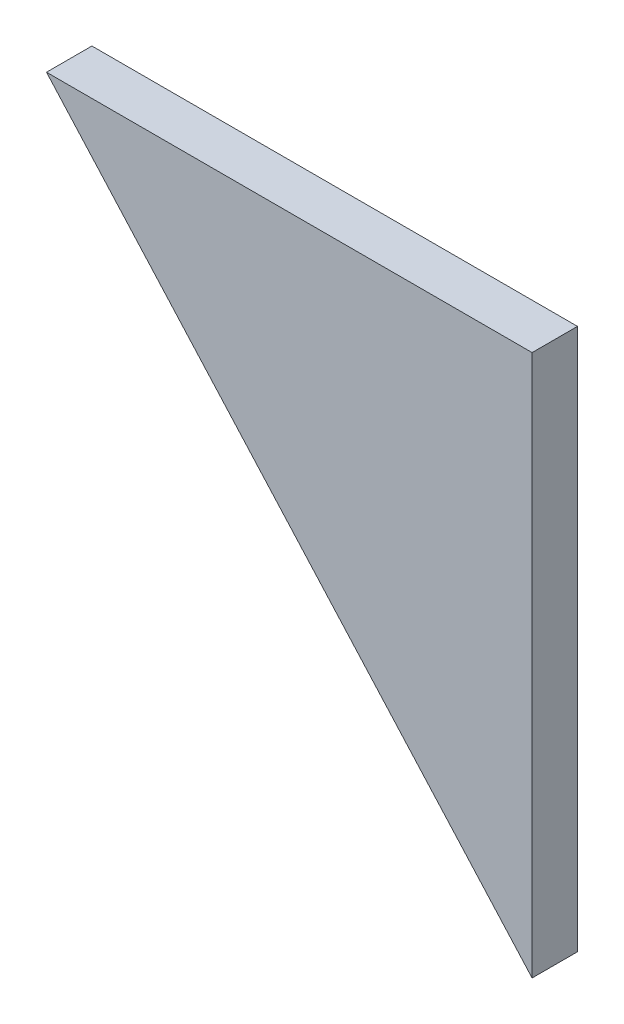
ISO-10303-21;
HEADER;
FILE_DESCRIPTION(('STEP AP214'),'2;1');
FILE_NAME('part.step','',(''),(''),'','','');
FILE_SCHEMA(('AUTOMOTIVE_DESIGN { 1 0 10303 214 1 1 1 1 }'));
ENDSEC;
DATA;
#1=APPLICATION_CONTEXT('core data for automotive mechanical design processes');
#2=APPLICATION_PROTOCOL_DEFINITION('international standard','automotive_design',2000,#1);
#3=PRODUCT_CONTEXT('',#1,'mechanical');
#4=PRODUCT('Part','Part','',(#3));
#5=PRODUCT_RELATED_PRODUCT_CATEGORY('part','',(#4));
#6=PRODUCT_DEFINITION_FORMATION('','',#4);
#7=PRODUCT_DEFINITION_CONTEXT('part definition',#1,'design');
#8=PRODUCT_DEFINITION('design','',#6,#7);
#9=PRODUCT_DEFINITION_SHAPE('','',#8);
#10=(LENGTH_UNIT() NAMED_UNIT(*) SI_UNIT(.MILLI.,.METRE.));
#11=(NAMED_UNIT(*) PLANE_ANGLE_UNIT() SI_UNIT($,.RADIAN.));
#12=(NAMED_UNIT(*) SI_UNIT($,.STERADIAN.) SOLID_ANGLE_UNIT());
#13=UNCERTAINTY_MEASURE_WITH_UNIT(LENGTH_MEASURE(1.E-05),#10,'distance_accuracy_value','');
#14=(GEOMETRIC_REPRESENTATION_CONTEXT(3) GLOBAL_UNCERTAINTY_ASSIGNED_CONTEXT((#13)) GLOBAL_UNIT_ASSIGNED_CONTEXT((#10,
#11,#12)) REPRESENTATION_CONTEXT('',''));
#15=CARTESIAN_POINT('',(0.,0.,0.));
#16=DIRECTION('',(0.,0.,1.));
#17=DIRECTION('',(1.,0.,0.));
#18=AXIS2_PLACEMENT_3D('',#15,#16,#17);
#19=CARTESIAN_POINT('',(1.304639369122,1.276331410143,0.005));
#20=DIRECTION('',(0.,0.,1.));
#21=DIRECTION('',(1.,0.,0.));
#22=AXIS2_PLACEMENT_3D('',#19,#20,#21);
#23=PLANE('',#22);
#24=DIRECTION('',(0.66754502804405,-0.744569429626055,0.));
#25=VECTOR('',#24,1.);
#26=CARTESIAN_POINT('',(1.234653649849,1.319472511729,0.005));
#27=LINE('',#26,#25);
#28=CARTESIAN_POINT('',(1.234653649849,1.319472511729,0.005));
#29=VERTEX_POINT('',#28);
#30=CARTESIAN_POINT('',(1.341609918716,1.200175138879,0.005));
#31=VERTEX_POINT('',#30);
#32=EDGE_CURVE('E11',#29,#31,#27,.T.);
#33=ORIENTED_EDGE('',*,*,#32,.T.);
#34=DIRECTION('',(0.,1.,0.));
#35=VECTOR('',#34,1.);
#36=CARTESIAN_POINT('',(1.341609918716,1.200175138879,0.005));
#37=LINE('',#36,#35);
#38=CARTESIAN_POINT('',(1.341609918716,1.319472511729,0.005));
#39=VERTEX_POINT('',#38);
#40=EDGE_CURVE('E43',#31,#39,#37,.T.);
#41=ORIENTED_EDGE('',*,*,#40,.T.);
#42=DIRECTION('',(-1.,0.,0.));
#43=VECTOR('',#42,1.);
#44=CARTESIAN_POINT('',(1.341609918716,1.319472511729,0.005));
#45=LINE('',#44,#43);
#46=EDGE_CURVE('E92',#39,#29,#45,.T.);
#47=ORIENTED_EDGE('',*,*,#46,.T.);
#48=EDGE_LOOP('',(#33,#41,#47));
#49=FACE_BOUND('',#48,.T.);
#50=ADVANCED_FACE('F16',(#49),#23,.T.);
#51=CARTESIAN_POINT('',(1.234653649849,1.319472511729,0.));
#52=DIRECTION('',(-0.744569429626055,-0.66754502804405,0.));
#53=DIRECTION('',(-0.66754502804405,0.744569429626055,0.));
#54=AXIS2_PLACEMENT_3D('',#51,#52,#53);
#55=PLANE('',#54);
#56=DIRECTION('',(0.,0.,1.));
#57=VECTOR('',#56,1.);
#58=CARTESIAN_POINT('',(1.341609918716,1.200175138879,0.));
#59=LINE('',#58,#57);
#60=CARTESIAN_POINT('',(1.341609918716,1.200175138879,-0.005));
#61=VERTEX_POINT('',#60);
#62=EDGE_CURVE('E20',#61,#31,#59,.T.);
#63=ORIENTED_EDGE('',*,*,#62,.T.);
#64=ORIENTED_EDGE('',*,*,#32,.F.);
#65=DIRECTION('',(0.,0.,-1.));
#66=VECTOR('',#65,1.);
#67=CARTESIAN_POINT('',(1.234653649849,1.319472511729,0.));
#68=LINE('',#67,#66);
#69=CARTESIAN_POINT('',(1.234653649849,1.319472511729,-0.005));
#70=VERTEX_POINT('',#69);
#71=EDGE_CURVE('E64',#29,#70,#68,.T.);
#72=ORIENTED_EDGE('',*,*,#71,.T.);
#73=DIRECTION('',(-0.66754502804405,0.744569429626055,0.));
#74=VECTOR('',#73,1.);
#75=CARTESIAN_POINT('',(1.234653649849,1.319472511729,-0.005));
#76=LINE('',#75,#74);
#77=EDGE_CURVE('E77',#61,#70,#76,.T.);
#78=ORIENTED_EDGE('',*,*,#77,.F.);
#79=EDGE_LOOP('',(#63,#64,#72,#78));
#80=FACE_BOUND('',#79,.T.);
#81=ADVANCED_FACE('F81',(#80),#55,.T.);
#82=CARTESIAN_POINT('',(1.341609918716,1.200175138879,0.));
#83=DIRECTION('',(1.,0.,0.));
#84=DIRECTION('',(0.,1.,0.));
#85=AXIS2_PLACEMENT_3D('',#82,#83,#84);
#86=PLANE('',#85);
#87=DIRECTION('',(0.,0.,1.));
#88=VECTOR('',#87,1.);
#89=CARTESIAN_POINT('',(1.341609918716,1.319472511729,0.));
#90=LINE('',#89,#88);
#91=CARTESIAN_POINT('',(1.341609918716,1.319472511729,-0.005));
#92=VERTEX_POINT('',#91);
#93=EDGE_CURVE('E54',#92,#39,#90,.T.);
#94=ORIENTED_EDGE('',*,*,#93,.T.);
#95=ORIENTED_EDGE('',*,*,#40,.F.);
#96=ORIENTED_EDGE('',*,*,#62,.F.);
#97=DIRECTION('',(0.,-1.,0.));
#98=VECTOR('',#97,1.);
#99=CARTESIAN_POINT('',(1.341609918716,1.200175138879,-0.005));
#100=LINE('',#99,#98);
#101=EDGE_CURVE('E71',#92,#61,#100,.T.);
#102=ORIENTED_EDGE('',*,*,#101,.F.);
#103=EDGE_LOOP('',(#94,#95,#96,#102));
#104=FACE_BOUND('',#103,.T.);
#105=ADVANCED_FACE('F18',(#104),#86,.T.);
#106=CARTESIAN_POINT('',(1.341609918716,1.319472511729,0.));
#107=DIRECTION('',(0.,1.,0.));
#108=DIRECTION('',(1.,0.,0.));
#109=AXIS2_PLACEMENT_3D('',#106,#107,#108);
#110=PLANE('',#109);
#111=ORIENTED_EDGE('',*,*,#71,.F.);
#112=ORIENTED_EDGE('',*,*,#46,.F.);
#113=ORIENTED_EDGE('',*,*,#93,.F.);
#114=DIRECTION('',(1.,0.,0.));
#115=VECTOR('',#114,1.);
#116=CARTESIAN_POINT('',(1.341609918716,1.319472511729,-0.005));
#117=LINE('',#116,#115);
#118=EDGE_CURVE('E78',#70,#92,#117,.T.);
#119=ORIENTED_EDGE('',*,*,#118,.F.);
#120=EDGE_LOOP('',(#111,#112,#113,#119));
#121=FACE_BOUND('',#120,.T.);
#122=ADVANCED_FACE('F102',(#121),#110,.T.);
#123=CARTESIAN_POINT('',(1.304639369122,1.276331410143,-0.005));
#124=DIRECTION('',(0.,0.,-1.));
#125=DIRECTION('',(0.,-1.,0.));
#126=AXIS2_PLACEMENT_3D('',#123,#124,#125);
#127=PLANE('',#126);
#128=ORIENTED_EDGE('',*,*,#77,.T.);
#129=ORIENTED_EDGE('',*,*,#118,.T.);
#130=ORIENTED_EDGE('',*,*,#101,.T.);
#131=EDGE_LOOP('',(#128,#129,#130));
#132=FACE_BOUND('',#131,.T.);
#133=ADVANCED_FACE('F76',(#132),#127,.T.);
#134=CLOSED_SHELL('',(#50,#81,#105,#122,#133));
#135=MANIFOLD_SOLID_BREP('B1',#134);
#136=ADVANCED_BREP_SHAPE_REPRESENTATION('',(#18,#135),#14);
#137=SHAPE_DEFINITION_REPRESENTATION(#9,#136);
ENDSEC;
END-ISO-10303-21;
